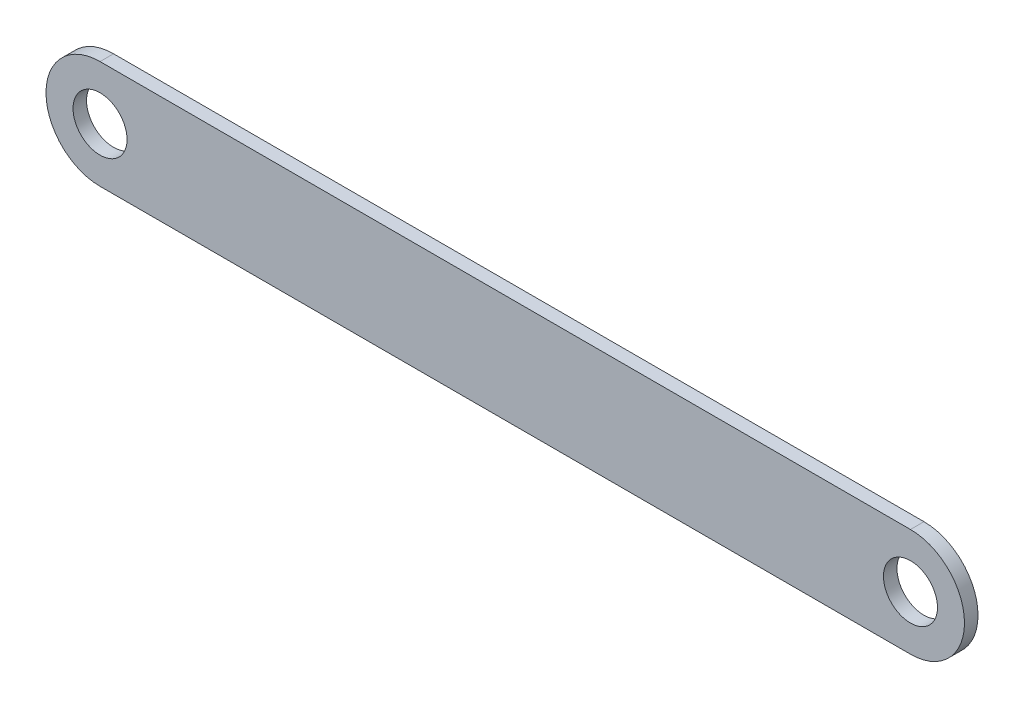
ISO-10303-21;
HEADER;
FILE_DESCRIPTION(('STEP AP214'),'2;1');
FILE_NAME('part.step','',(''),(''),'','','');
FILE_SCHEMA(('AUTOMOTIVE_DESIGN { 1 0 10303 214 1 1 1 1 }'));
ENDSEC;
DATA;
#1=APPLICATION_CONTEXT('core data for automotive mechanical design processes');
#2=APPLICATION_PROTOCOL_DEFINITION('international standard','automotive_design',2000,#1);
#3=PRODUCT_CONTEXT('',#1,'mechanical');
#4=PRODUCT('Part','Part','',(#3));
#5=PRODUCT_RELATED_PRODUCT_CATEGORY('part','',(#4));
#6=PRODUCT_DEFINITION_FORMATION('','',#4);
#7=PRODUCT_DEFINITION_CONTEXT('part definition',#1,'design');
#8=PRODUCT_DEFINITION('design','',#6,#7);
#9=PRODUCT_DEFINITION_SHAPE('','',#8);
#10=(LENGTH_UNIT() NAMED_UNIT(*) SI_UNIT(.MILLI.,.METRE.));
#11=(NAMED_UNIT(*) PLANE_ANGLE_UNIT() SI_UNIT($,.RADIAN.));
#12=(NAMED_UNIT(*) SI_UNIT($,.STERADIAN.) SOLID_ANGLE_UNIT());
#13=UNCERTAINTY_MEASURE_WITH_UNIT(LENGTH_MEASURE(1.E-05),#10,'distance_accuracy_value','');
#14=(GEOMETRIC_REPRESENTATION_CONTEXT(3) GLOBAL_UNCERTAINTY_ASSIGNED_CONTEXT((#13)) GLOBAL_UNIT_ASSIGNED_CONTEXT((#10,
#11,#12)) REPRESENTATION_CONTEXT('',''));
#15=CARTESIAN_POINT('',(0.,0.,0.));
#16=DIRECTION('',(0.,0.,1.));
#17=DIRECTION('',(1.,0.,0.));
#18=AXIS2_PLACEMENT_3D('',#15,#16,#17);
#19=CARTESIAN_POINT('',(0.,0.,5.));
#20=DIRECTION('',(0.,0.,1.));
#21=DIRECTION('',(1.,0.,0.));
#22=AXIS2_PLACEMENT_3D('',#19,#20,#21);
#23=PLANE('',#22);
#24=CARTESIAN_POINT('',(0.,0.,5.));
#25=DIRECTION('',(0.,0.,1.));
#26=DIRECTION('',(1.,0.,0.));
#27=AXIS2_PLACEMENT_3D('',#24,#25,#26);
#28=CIRCLE('',#27,10.);
#29=CARTESIAN_POINT('',(10.,0.,5.));
#30=VERTEX_POINT('',#29);
#31=EDGE_CURVE('E103',#30,#30,#28,.T.);
#32=ORIENTED_EDGE('',*,*,#31,.F.);
#33=EDGE_LOOP('',(#32));
#34=FACE_BOUND('',#33,.T.);
#35=CARTESIAN_POINT('',(0.,0.,5.));
#36=DIRECTION('',(0.,0.,1.));
#37=DIRECTION('',(1.,0.,0.));
#38=AXIS2_PLACEMENT_3D('',#35,#36,#37);
#39=CIRCLE('',#38,20.);
#40=CARTESIAN_POINT('',(0.,20.,5.));
#41=VERTEX_POINT('',#40);
#42=CARTESIAN_POINT('',(0.,-20.,5.));
#43=VERTEX_POINT('',#42);
#44=EDGE_CURVE('E88',#41,#43,#39,.T.);
#45=ORIENTED_EDGE('',*,*,#44,.T.);
#46=DIRECTION('',(1.,0.,0.));
#47=VECTOR('',#46,1.);
#48=CARTESIAN_POINT('',(0.,-20.,5.));
#49=LINE('',#48,#47);
#50=CARTESIAN_POINT('',(300.,-20.,5.));
#51=VERTEX_POINT('',#50);
#52=EDGE_CURVE('E83',#43,#51,#49,.T.);
#53=ORIENTED_EDGE('',*,*,#52,.T.);
#54=CARTESIAN_POINT('',(300.,0.,5.));
#55=DIRECTION('',(0.,0.,1.));
#56=DIRECTION('',(1.,0.,0.));
#57=AXIS2_PLACEMENT_3D('',#54,#55,#56);
#58=CIRCLE('',#57,20.);
#59=CARTESIAN_POINT('',(300.,20.,5.));
#60=VERTEX_POINT('',#59);
#61=EDGE_CURVE('E86',#51,#60,#58,.T.);
#62=ORIENTED_EDGE('',*,*,#61,.T.);
#63=DIRECTION('',(-1.,0.,0.));
#64=VECTOR('',#63,1.);
#65=CARTESIAN_POINT('',(0.,20.,5.));
#66=LINE('',#65,#64);
#67=EDGE_CURVE('E53',#60,#41,#66,.T.);
#68=ORIENTED_EDGE('',*,*,#67,.T.);
#69=EDGE_LOOP('',(#45,#53,#62,#68));
#70=FACE_BOUND('',#69,.T.);
#71=CARTESIAN_POINT('',(300.,0.,5.));
#72=DIRECTION('',(0.,0.,1.));
#73=DIRECTION('',(1.,0.,0.));
#74=AXIS2_PLACEMENT_3D('',#71,#72,#73);
#75=CIRCLE('',#74,10.);
#76=CARTESIAN_POINT('',(310.,0.,5.));
#77=VERTEX_POINT('',#76);
#78=EDGE_CURVE('E118',#77,#77,#75,.T.);
#79=ORIENTED_EDGE('',*,*,#78,.F.);
#80=EDGE_LOOP('',(#79));
#81=FACE_BOUND('',#80,.T.);
#82=ADVANCED_FACE('F36',(#34,#70,#81),#23,.T.);
#83=CARTESIAN_POINT('',(0.,0.,0.));
#84=DIRECTION('',(0.,0.,1.));
#85=DIRECTION('',(1.,0.,0.));
#86=AXIS2_PLACEMENT_3D('',#83,#84,#85);
#87=PLANE('',#86);
#88=CARTESIAN_POINT('',(0.,0.,0.));
#89=DIRECTION('',(0.,0.,1.));
#90=DIRECTION('',(1.,0.,0.));
#91=AXIS2_PLACEMENT_3D('',#88,#89,#90);
#92=CIRCLE('',#91,20.);
#93=CARTESIAN_POINT('',(0.,20.,0.));
#94=VERTEX_POINT('',#93);
#95=CARTESIAN_POINT('',(0.,-20.,0.));
#96=VERTEX_POINT('',#95);
#97=EDGE_CURVE('E100',#94,#96,#92,.T.);
#98=ORIENTED_EDGE('',*,*,#97,.F.);
#99=DIRECTION('',(-1.,0.,0.));
#100=VECTOR('',#99,1.);
#101=CARTESIAN_POINT('',(0.,20.,0.));
#102=LINE('',#101,#100);
#103=CARTESIAN_POINT('',(300.,20.,0.));
#104=VERTEX_POINT('',#103);
#105=EDGE_CURVE('E76',#104,#94,#102,.T.);
#106=ORIENTED_EDGE('',*,*,#105,.F.);
#107=CARTESIAN_POINT('',(300.,0.,0.));
#108=DIRECTION('',(0.,0.,1.));
#109=DIRECTION('',(1.,0.,0.));
#110=AXIS2_PLACEMENT_3D('',#107,#108,#109);
#111=CIRCLE('',#110,20.);
#112=CARTESIAN_POINT('',(300.,-20.,0.));
#113=VERTEX_POINT('',#112);
#114=EDGE_CURVE('E70',#113,#104,#111,.T.);
#115=ORIENTED_EDGE('',*,*,#114,.F.);
#116=DIRECTION('',(1.,0.,0.));
#117=VECTOR('',#116,1.);
#118=CARTESIAN_POINT('',(0.,-20.,0.));
#119=LINE('',#118,#117);
#120=EDGE_CURVE('E92',#96,#113,#119,.T.);
#121=ORIENTED_EDGE('',*,*,#120,.F.);
#122=EDGE_LOOP('',(#98,#106,#115,#121));
#123=FACE_BOUND('',#122,.T.);
#124=CARTESIAN_POINT('',(0.,0.,0.));
#125=DIRECTION('',(0.,0.,1.));
#126=DIRECTION('',(1.,0.,0.));
#127=AXIS2_PLACEMENT_3D('',#124,#125,#126);
#128=CIRCLE('',#127,10.);
#129=CARTESIAN_POINT('',(10.,0.,0.));
#130=VERTEX_POINT('',#129);
#131=EDGE_CURVE('E115',#130,#130,#128,.T.);
#132=ORIENTED_EDGE('',*,*,#131,.T.);
#133=EDGE_LOOP('',(#132));
#134=FACE_BOUND('',#133,.T.);
#135=CARTESIAN_POINT('',(300.,0.,0.));
#136=DIRECTION('',(0.,0.,1.));
#137=DIRECTION('',(1.,0.,0.));
#138=AXIS2_PLACEMENT_3D('',#135,#136,#137);
#139=CIRCLE('',#138,10.);
#140=CARTESIAN_POINT('',(310.,0.,0.));
#141=VERTEX_POINT('',#140);
#142=EDGE_CURVE('E121',#141,#141,#139,.T.);
#143=ORIENTED_EDGE('',*,*,#142,.T.);
#144=EDGE_LOOP('',(#143));
#145=FACE_BOUND('',#144,.T.);
#146=ADVANCED_FACE('F111',(#123,#134,#145),#87,.F.);
#147=CARTESIAN_POINT('',(0.,0.,5.));
#148=DIRECTION('',(0.,0.,-1.));
#149=DIRECTION('',(-1.,0.,0.));
#150=AXIS2_PLACEMENT_3D('',#147,#148,#149);
#151=CYLINDRICAL_SURFACE('',#150,20.);
#152=ORIENTED_EDGE('',*,*,#97,.T.);
#153=DIRECTION('',(0.,0.,-1.));
#154=VECTOR('',#153,1.);
#155=CARTESIAN_POINT('',(0.,-20.,5.));
#156=LINE('',#155,#154);
#157=EDGE_CURVE('E11',#43,#96,#156,.T.);
#158=ORIENTED_EDGE('',*,*,#157,.F.);
#159=ORIENTED_EDGE('',*,*,#44,.F.);
#160=DIRECTION('',(0.,0.,-1.));
#161=VECTOR('',#160,1.);
#162=CARTESIAN_POINT('',(0.,20.,5.));
#163=LINE('',#162,#161);
#164=EDGE_CURVE('E96',#41,#94,#163,.T.);
#165=ORIENTED_EDGE('',*,*,#164,.T.);
#166=EDGE_LOOP('',(#152,#158,#159,#165));
#167=FACE_BOUND('',#166,.T.);
#168=ADVANCED_FACE('F38',(#167),#151,.T.);
#169=CARTESIAN_POINT('',(0.,-20.,5.));
#170=DIRECTION('',(0.,1.,0.));
#171=DIRECTION('',(0.,0.,1.));
#172=AXIS2_PLACEMENT_3D('',#169,#170,#171);
#173=PLANE('',#172);
#174=ORIENTED_EDGE('',*,*,#120,.T.);
#175=DIRECTION('',(0.,0.,-1.));
#176=VECTOR('',#175,1.);
#177=CARTESIAN_POINT('',(300.,-20.,5.));
#178=LINE('',#177,#176);
#179=EDGE_CURVE('E45',#51,#113,#178,.T.);
#180=ORIENTED_EDGE('',*,*,#179,.F.);
#181=ORIENTED_EDGE('',*,*,#52,.F.);
#182=ORIENTED_EDGE('',*,*,#157,.T.);
#183=EDGE_LOOP('',(#174,#180,#181,#182));
#184=FACE_BOUND('',#183,.T.);
#185=ADVANCED_FACE('F91',(#184),#173,.F.);
#186=CARTESIAN_POINT('',(300.,0.,5.));
#187=DIRECTION('',(0.,0.,-1.));
#188=DIRECTION('',(-1.,0.,0.));
#189=AXIS2_PLACEMENT_3D('',#186,#187,#188);
#190=CYLINDRICAL_SURFACE('',#189,20.);
#191=ORIENTED_EDGE('',*,*,#114,.T.);
#192=DIRECTION('',(0.,0.,-1.));
#193=VECTOR('',#192,1.);
#194=CARTESIAN_POINT('',(300.,20.,5.));
#195=LINE('',#194,#193);
#196=EDGE_CURVE('E93',#60,#104,#195,.T.);
#197=ORIENTED_EDGE('',*,*,#196,.F.);
#198=ORIENTED_EDGE('',*,*,#61,.F.);
#199=ORIENTED_EDGE('',*,*,#179,.T.);
#200=EDGE_LOOP('',(#191,#197,#198,#199));
#201=FACE_BOUND('',#200,.T.);
#202=ADVANCED_FACE('F94',(#201),#190,.T.);
#203=CARTESIAN_POINT('',(0.,20.,5.));
#204=DIRECTION('',(0.,-1.,0.));
#205=DIRECTION('',(0.,0.,-1.));
#206=AXIS2_PLACEMENT_3D('',#203,#204,#205);
#207=PLANE('',#206);
#208=ORIENTED_EDGE('',*,*,#105,.T.);
#209=ORIENTED_EDGE('',*,*,#164,.F.);
#210=ORIENTED_EDGE('',*,*,#67,.F.);
#211=ORIENTED_EDGE('',*,*,#196,.T.);
#212=EDGE_LOOP('',(#208,#209,#210,#211));
#213=FACE_BOUND('',#212,.T.);
#214=ADVANCED_FACE('F108',(#213),#207,.F.);
#215=CARTESIAN_POINT('',(0.,0.,5.));
#216=DIRECTION('',(0.,0.,-1.));
#217=DIRECTION('',(-1.,0.,0.));
#218=AXIS2_PLACEMENT_3D('',#215,#216,#217);
#219=CYLINDRICAL_SURFACE('',#218,10.);
#220=ORIENTED_EDGE('',*,*,#31,.T.);
#221=EDGE_LOOP('',(#220));
#222=FACE_BOUND('',#221,.T.);
#223=ORIENTED_EDGE('',*,*,#131,.F.);
#224=EDGE_LOOP('',(#223));
#225=FACE_BOUND('',#224,.T.);
#226=ADVANCED_FACE('F138',(#222,#225),#219,.F.);
#227=CARTESIAN_POINT('',(300.,0.,5.));
#228=DIRECTION('',(0.,0.,-1.));
#229=DIRECTION('',(-1.,0.,0.));
#230=AXIS2_PLACEMENT_3D('',#227,#228,#229);
#231=CYLINDRICAL_SURFACE('',#230,10.);
#232=ORIENTED_EDGE('',*,*,#78,.T.);
#233=EDGE_LOOP('',(#232));
#234=FACE_BOUND('',#233,.T.);
#235=ORIENTED_EDGE('',*,*,#142,.F.);
#236=EDGE_LOOP('',(#235));
#237=FACE_BOUND('',#236,.T.);
#238=ADVANCED_FACE('F127',(#234,#237),#231,.F.);
#239=CLOSED_SHELL('',(#82,#146,#168,#185,#202,#214,#226,#238));
#240=MANIFOLD_SOLID_BREP('B2',#239);
#241=ADVANCED_BREP_SHAPE_REPRESENTATION('',(#18,#240),#14);
#242=SHAPE_DEFINITION_REPRESENTATION(#9,#241);
ENDSEC;
END-ISO-10303-21;
